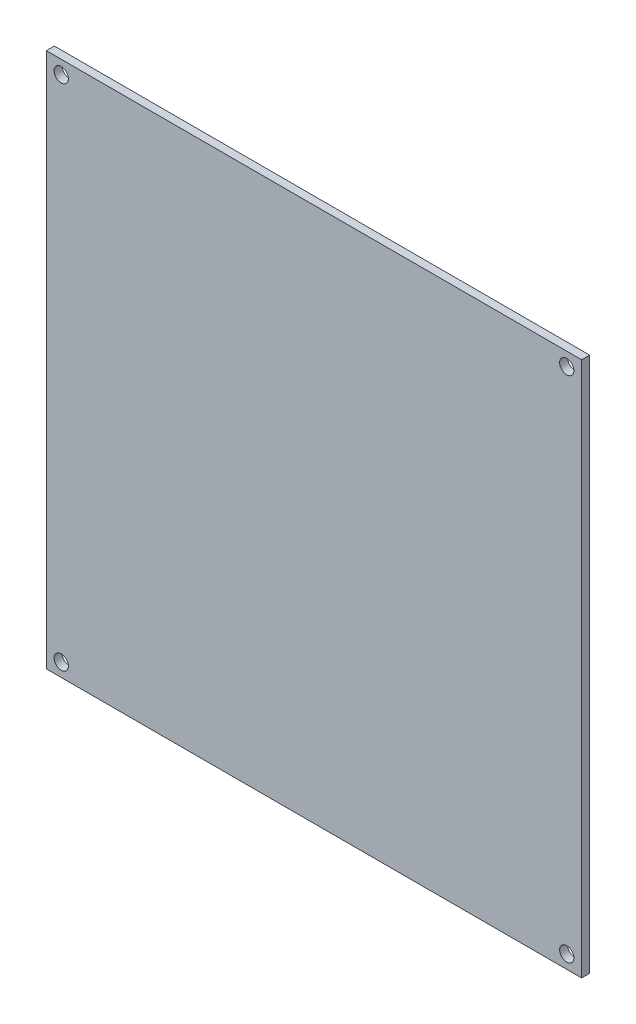
ISO-10303-21;
HEADER;
FILE_DESCRIPTION(('STEP AP214'),'2;1');
FILE_NAME('part.step','',(''),(''),'','','');
FILE_SCHEMA(('AUTOMOTIVE_DESIGN { 1 0 10303 214 1 1 1 1 }'));
ENDSEC;
DATA;
#1=APPLICATION_CONTEXT('core data for automotive mechanical design processes');
#2=APPLICATION_PROTOCOL_DEFINITION('international standard','automotive_design',2000,#1);
#3=PRODUCT_CONTEXT('',#1,'mechanical');
#4=PRODUCT('Part','Part','',(#3));
#5=PRODUCT_RELATED_PRODUCT_CATEGORY('part','',(#4));
#6=PRODUCT_DEFINITION_FORMATION('','',#4);
#7=PRODUCT_DEFINITION_CONTEXT('part definition',#1,'design');
#8=PRODUCT_DEFINITION('design','',#6,#7);
#9=PRODUCT_DEFINITION_SHAPE('','',#8);
#10=(LENGTH_UNIT() NAMED_UNIT(*) SI_UNIT(.MILLI.,.METRE.));
#11=(NAMED_UNIT(*) PLANE_ANGLE_UNIT() SI_UNIT($,.RADIAN.));
#12=(NAMED_UNIT(*) SI_UNIT($,.STERADIAN.) SOLID_ANGLE_UNIT());
#13=UNCERTAINTY_MEASURE_WITH_UNIT(LENGTH_MEASURE(1.E-05),#10,'distance_accuracy_value','');
#14=(GEOMETRIC_REPRESENTATION_CONTEXT(3) GLOBAL_UNCERTAINTY_ASSIGNED_CONTEXT((#13)) GLOBAL_UNIT_ASSIGNED_CONTEXT((#10,
#11,#12)) REPRESENTATION_CONTEXT('',''));
#15=CARTESIAN_POINT('',(0.,0.,0.));
#16=DIRECTION('',(0.,0.,1.));
#17=DIRECTION('',(1.,0.,0.));
#18=AXIS2_PLACEMENT_3D('',#15,#16,#17);
#19=CARTESIAN_POINT('',(0.,0.,1.8));
#20=DIRECTION('',(0.,0.,-1.));
#21=DIRECTION('',(-1.,0.,0.));
#22=AXIS2_PLACEMENT_3D('',#19,#20,#21);
#23=PLANE('',#22);
#24=DIRECTION('',(0.,-1.,0.));
#25=VECTOR('',#24,1.);
#26=CARTESIAN_POINT('',(0.,0.,1.8));
#27=LINE('',#26,#25);
#28=CARTESIAN_POINT('',(0.,120.,1.8));
#29=VERTEX_POINT('',#28);
#30=CARTESIAN_POINT('',(0.,0.,1.8));
#31=VERTEX_POINT('',#30);
#32=EDGE_CURVE('E85',#29,#31,#27,.T.);
#33=ORIENTED_EDGE('',*,*,#32,.T.);
#34=DIRECTION('',(1.,0.,0.));
#35=VECTOR('',#34,1.);
#36=CARTESIAN_POINT('',(0.,0.,1.8));
#37=LINE('',#36,#35);
#38=CARTESIAN_POINT('',(120.,0.,1.8));
#39=VERTEX_POINT('',#38);
#40=EDGE_CURVE('E80',#31,#39,#37,.T.);
#41=ORIENTED_EDGE('',*,*,#40,.T.);
#42=DIRECTION('',(0.,1.,0.));
#43=VECTOR('',#42,1.);
#44=CARTESIAN_POINT('',(120.,0.,1.8));
#45=LINE('',#44,#43);
#46=CARTESIAN_POINT('',(120.,120.,1.8));
#47=VERTEX_POINT('',#46);
#48=EDGE_CURVE('E83',#39,#47,#45,.T.);
#49=ORIENTED_EDGE('',*,*,#48,.T.);
#50=DIRECTION('',(-1.,0.,0.));
#51=VECTOR('',#50,1.);
#52=CARTESIAN_POINT('',(0.,120.,1.8));
#53=LINE('',#52,#51);
#54=EDGE_CURVE('E50',#47,#29,#53,.T.);
#55=ORIENTED_EDGE('',*,*,#54,.T.);
#56=EDGE_LOOP('',(#33,#41,#49,#55));
#57=FACE_BOUND('',#56,.T.);
#58=CARTESIAN_POINT('',(3.35,117.,1.8));
#59=DIRECTION('',(0.,0.,1.));
#60=DIRECTION('',(1.,0.,0.));
#61=AXIS2_PLACEMENT_3D('',#58,#59,#60);
#62=CIRCLE('',#61,1.60000000000001);
#63=CARTESIAN_POINT('',(4.95000000000001,117.,1.8));
#64=VERTEX_POINT('',#63);
#65=EDGE_CURVE('E100',#64,#64,#62,.T.);
#66=ORIENTED_EDGE('',*,*,#65,.F.);
#67=EDGE_LOOP('',(#66));
#68=FACE_BOUND('',#67,.T.);
#69=CARTESIAN_POINT('',(116.65,117.,1.8));
#70=DIRECTION('',(0.,0.,1.));
#71=DIRECTION('',(1.,0.,0.));
#72=AXIS2_PLACEMENT_3D('',#69,#70,#71);
#73=CIRCLE('',#72,1.60000000000001);
#74=CARTESIAN_POINT('',(118.25,117.,1.8));
#75=VERTEX_POINT('',#74);
#76=EDGE_CURVE('E115',#75,#75,#73,.T.);
#77=ORIENTED_EDGE('',*,*,#76,.F.);
#78=EDGE_LOOP('',(#77));
#79=FACE_BOUND('',#78,.T.);
#80=CARTESIAN_POINT('',(116.65,2.99999999999999,1.8));
#81=DIRECTION('',(0.,0.,1.));
#82=DIRECTION('',(1.,0.,0.));
#83=AXIS2_PLACEMENT_3D('',#80,#81,#82);
#84=CIRCLE('',#83,1.60000000000001);
#85=CARTESIAN_POINT('',(118.25,2.99999999999999,1.8));
#86=VERTEX_POINT('',#85);
#87=EDGE_CURVE('E121',#86,#86,#84,.T.);
#88=ORIENTED_EDGE('',*,*,#87,.F.);
#89=EDGE_LOOP('',(#88));
#90=FACE_BOUND('',#89,.T.);
#91=CARTESIAN_POINT('',(3.35,2.99999999999999,1.8));
#92=DIRECTION('',(0.,0.,1.));
#93=DIRECTION('',(1.,0.,0.));
#94=AXIS2_PLACEMENT_3D('',#91,#92,#93);
#95=CIRCLE('',#94,1.6);
#96=CARTESIAN_POINT('',(4.95,2.99999999999999,1.8));
#97=VERTEX_POINT('',#96);
#98=EDGE_CURVE('E127',#97,#97,#95,.T.);
#99=ORIENTED_EDGE('',*,*,#98,.F.);
#100=EDGE_LOOP('',(#99));
#101=FACE_BOUND('',#100,.T.);
#102=ADVANCED_FACE('F33',(#57,#68,#79,#90,#101),#23,.F.);
#103=CARTESIAN_POINT('',(0.,0.,0.));
#104=DIRECTION('',(0.,0.,-1.));
#105=DIRECTION('',(-1.,0.,0.));
#106=AXIS2_PLACEMENT_3D('',#103,#104,#105);
#107=PLANE('',#106);
#108=CARTESIAN_POINT('',(116.65,2.99999999999999,0.));
#109=DIRECTION('',(0.,0.,1.));
#110=DIRECTION('',(1.,0.,0.));
#111=AXIS2_PLACEMENT_3D('',#108,#109,#110);
#112=CIRCLE('',#111,1.60000000000001);
#113=CARTESIAN_POINT('',(118.25,2.99999999999999,0.));
#114=VERTEX_POINT('',#113);
#115=EDGE_CURVE('E124',#114,#114,#112,.T.);
#116=ORIENTED_EDGE('',*,*,#115,.T.);
#117=EDGE_LOOP('',(#116));
#118=FACE_BOUND('',#117,.T.);
#119=CARTESIAN_POINT('',(3.35,117.,0.));
#120=DIRECTION('',(0.,0.,1.));
#121=DIRECTION('',(1.,0.,0.));
#122=AXIS2_PLACEMENT_3D('',#119,#120,#121);
#123=CIRCLE('',#122,1.60000000000001);
#124=CARTESIAN_POINT('',(4.95000000000001,117.,0.));
#125=VERTEX_POINT('',#124);
#126=EDGE_CURVE('E112',#125,#125,#123,.T.);
#127=ORIENTED_EDGE('',*,*,#126,.T.);
#128=EDGE_LOOP('',(#127));
#129=FACE_BOUND('',#128,.T.);
#130=DIRECTION('',(0.,-1.,0.));
#131=VECTOR('',#130,1.);
#132=CARTESIAN_POINT('',(0.,0.,0.));
#133=LINE('',#132,#131);
#134=CARTESIAN_POINT('',(0.,120.,0.));
#135=VERTEX_POINT('',#134);
#136=CARTESIAN_POINT('',(0.,0.,0.));
#137=VERTEX_POINT('',#136);
#138=EDGE_CURVE('E97',#135,#137,#133,.T.);
#139=ORIENTED_EDGE('',*,*,#138,.F.);
#140=DIRECTION('',(-1.,0.,0.));
#141=VECTOR('',#140,1.);
#142=CARTESIAN_POINT('',(0.,120.,0.));
#143=LINE('',#142,#141);
#144=CARTESIAN_POINT('',(120.,120.,0.));
#145=VERTEX_POINT('',#144);
#146=EDGE_CURVE('E73',#145,#135,#143,.T.);
#147=ORIENTED_EDGE('',*,*,#146,.F.);
#148=DIRECTION('',(0.,1.,0.));
#149=VECTOR('',#148,1.);
#150=CARTESIAN_POINT('',(120.,0.,0.));
#151=LINE('',#150,#149);
#152=CARTESIAN_POINT('',(120.,0.,0.));
#153=VERTEX_POINT('',#152);
#154=EDGE_CURVE('E67',#153,#145,#151,.T.);
#155=ORIENTED_EDGE('',*,*,#154,.F.);
#156=DIRECTION('',(1.,0.,0.));
#157=VECTOR('',#156,1.);
#158=CARTESIAN_POINT('',(0.,0.,0.));
#159=LINE('',#158,#157);
#160=EDGE_CURVE('E89',#137,#153,#159,.T.);
#161=ORIENTED_EDGE('',*,*,#160,.F.);
#162=EDGE_LOOP('',(#139,#147,#155,#161));
#163=FACE_BOUND('',#162,.T.);
#164=CARTESIAN_POINT('',(116.65,117.,0.));
#165=DIRECTION('',(0.,0.,1.));
#166=DIRECTION('',(1.,0.,0.));
#167=AXIS2_PLACEMENT_3D('',#164,#165,#166);
#168=CIRCLE('',#167,1.60000000000001);
#169=CARTESIAN_POINT('',(118.25,117.,0.));
#170=VERTEX_POINT('',#169);
#171=EDGE_CURVE('E118',#170,#170,#168,.T.);
#172=ORIENTED_EDGE('',*,*,#171,.T.);
#173=EDGE_LOOP('',(#172));
#174=FACE_BOUND('',#173,.T.);
#175=CARTESIAN_POINT('',(3.35,2.99999999999999,0.));
#176=DIRECTION('',(0.,0.,1.));
#177=DIRECTION('',(1.,0.,0.));
#178=AXIS2_PLACEMENT_3D('',#175,#176,#177);
#179=CIRCLE('',#178,1.6);
#180=CARTESIAN_POINT('',(4.95,2.99999999999999,0.));
#181=VERTEX_POINT('',#180);
#182=EDGE_CURVE('E130',#181,#181,#179,.T.);
#183=ORIENTED_EDGE('',*,*,#182,.T.);
#184=EDGE_LOOP('',(#183));
#185=FACE_BOUND('',#184,.T.);
#186=ADVANCED_FACE('F108',(#118,#129,#163,#174,#185),#107,.T.);
#187=CARTESIAN_POINT('',(0.,0.,1.8));
#188=DIRECTION('',(1.,0.,0.));
#189=DIRECTION('',(0.,0.,-1.));
#190=AXIS2_PLACEMENT_3D('',#187,#188,#189);
#191=PLANE('',#190);
#192=ORIENTED_EDGE('',*,*,#138,.T.);
#193=DIRECTION('',(0.,0.,-1.));
#194=VECTOR('',#193,1.);
#195=CARTESIAN_POINT('',(0.,0.,1.8));
#196=LINE('',#195,#194);
#197=EDGE_CURVE('E11',#31,#137,#196,.T.);
#198=ORIENTED_EDGE('',*,*,#197,.F.);
#199=ORIENTED_EDGE('',*,*,#32,.F.);
#200=DIRECTION('',(0.,0.,-1.));
#201=VECTOR('',#200,1.);
#202=CARTESIAN_POINT('',(0.,120.,1.8));
#203=LINE('',#202,#201);
#204=EDGE_CURVE('E93',#29,#135,#203,.T.);
#205=ORIENTED_EDGE('',*,*,#204,.T.);
#206=EDGE_LOOP('',(#192,#198,#199,#205));
#207=FACE_BOUND('',#206,.T.);
#208=ADVANCED_FACE('F35',(#207),#191,.F.);
#209=CARTESIAN_POINT('',(0.,0.,1.8));
#210=DIRECTION('',(0.,1.,0.));
#211=DIRECTION('',(0.,0.,1.));
#212=AXIS2_PLACEMENT_3D('',#209,#210,#211);
#213=PLANE('',#212);
#214=ORIENTED_EDGE('',*,*,#160,.T.);
#215=DIRECTION('',(0.,0.,-1.));
#216=VECTOR('',#215,1.);
#217=CARTESIAN_POINT('',(120.,0.,1.8));
#218=LINE('',#217,#216);
#219=EDGE_CURVE('E42',#39,#153,#218,.T.);
#220=ORIENTED_EDGE('',*,*,#219,.F.);
#221=ORIENTED_EDGE('',*,*,#40,.F.);
#222=ORIENTED_EDGE('',*,*,#197,.T.);
#223=EDGE_LOOP('',(#214,#220,#221,#222));
#224=FACE_BOUND('',#223,.T.);
#225=ADVANCED_FACE('F88',(#224),#213,.F.);
#226=CARTESIAN_POINT('',(120.,0.,1.8));
#227=DIRECTION('',(-1.,0.,0.));
#228=DIRECTION('',(0.,0.,1.));
#229=AXIS2_PLACEMENT_3D('',#226,#227,#228);
#230=PLANE('',#229);
#231=ORIENTED_EDGE('',*,*,#154,.T.);
#232=DIRECTION('',(0.,0.,-1.));
#233=VECTOR('',#232,1.);
#234=CARTESIAN_POINT('',(120.,120.,1.8));
#235=LINE('',#234,#233);
#236=EDGE_CURVE('E90',#47,#145,#235,.T.);
#237=ORIENTED_EDGE('',*,*,#236,.F.);
#238=ORIENTED_EDGE('',*,*,#48,.F.);
#239=ORIENTED_EDGE('',*,*,#219,.T.);
#240=EDGE_LOOP('',(#231,#237,#238,#239));
#241=FACE_BOUND('',#240,.T.);
#242=ADVANCED_FACE('F91',(#241),#230,.F.);
#243=CARTESIAN_POINT('',(0.,120.,1.8));
#244=DIRECTION('',(0.,-1.,0.));
#245=DIRECTION('',(0.,0.,-1.));
#246=AXIS2_PLACEMENT_3D('',#243,#244,#245);
#247=PLANE('',#246);
#248=ORIENTED_EDGE('',*,*,#146,.T.);
#249=ORIENTED_EDGE('',*,*,#204,.F.);
#250=ORIENTED_EDGE('',*,*,#54,.F.);
#251=ORIENTED_EDGE('',*,*,#236,.T.);
#252=EDGE_LOOP('',(#248,#249,#250,#251));
#253=FACE_BOUND('',#252,.T.);
#254=ADVANCED_FACE('F105',(#253),#247,.F.);
#255=CARTESIAN_POINT('',(3.35,117.,1.8));
#256=DIRECTION('',(0.,0.,-1.));
#257=DIRECTION('',(-1.,0.,0.));
#258=AXIS2_PLACEMENT_3D('',#255,#256,#257);
#259=CYLINDRICAL_SURFACE('',#258,1.60000000000001);
#260=ORIENTED_EDGE('',*,*,#65,.T.);
#261=EDGE_LOOP('',(#260));
#262=FACE_BOUND('',#261,.T.);
#263=ORIENTED_EDGE('',*,*,#126,.F.);
#264=EDGE_LOOP('',(#263));
#265=FACE_BOUND('',#264,.T.);
#266=ADVANCED_FACE('F147',(#262,#265),#259,.F.);
#267=CARTESIAN_POINT('',(116.65,117.,1.8));
#268=DIRECTION('',(0.,0.,-1.));
#269=DIRECTION('',(-1.,0.,0.));
#270=AXIS2_PLACEMENT_3D('',#267,#268,#269);
#271=CYLINDRICAL_SURFACE('',#270,1.60000000000001);
#272=ORIENTED_EDGE('',*,*,#76,.T.);
#273=EDGE_LOOP('',(#272));
#274=FACE_BOUND('',#273,.T.);
#275=ORIENTED_EDGE('',*,*,#171,.F.);
#276=EDGE_LOOP('',(#275));
#277=FACE_BOUND('',#276,.T.);
#278=ADVANCED_FACE('F193',(#274,#277),#271,.F.);
#279=CARTESIAN_POINT('',(116.65,2.99999999999999,1.8));
#280=DIRECTION('',(0.,0.,-1.));
#281=DIRECTION('',(-1.,0.,0.));
#282=AXIS2_PLACEMENT_3D('',#279,#280,#281);
#283=CYLINDRICAL_SURFACE('',#282,1.60000000000001);
#284=ORIENTED_EDGE('',*,*,#87,.T.);
#285=EDGE_LOOP('',(#284));
#286=FACE_BOUND('',#285,.T.);
#287=ORIENTED_EDGE('',*,*,#115,.F.);
#288=EDGE_LOOP('',(#287));
#289=FACE_BOUND('',#288,.T.);
#290=ADVANCED_FACE('F201',(#286,#289),#283,.F.);
#291=CARTESIAN_POINT('',(3.35,2.99999999999999,1.8));
#292=DIRECTION('',(0.,0.,-1.));
#293=DIRECTION('',(-1.,0.,0.));
#294=AXIS2_PLACEMENT_3D('',#291,#292,#293);
#295=CYLINDRICAL_SURFACE('',#294,1.6);
#296=ORIENTED_EDGE('',*,*,#98,.T.);
#297=EDGE_LOOP('',(#296));
#298=FACE_BOUND('',#297,.T.);
#299=ORIENTED_EDGE('',*,*,#182,.F.);
#300=EDGE_LOOP('',(#299));
#301=FACE_BOUND('',#300,.T.);
#302=ADVANCED_FACE('F136',(#298,#301),#295,.F.);
#303=CLOSED_SHELL('',(#102,#186,#208,#225,#242,#254,#266,#278,#290,#302));
#304=MANIFOLD_SOLID_BREP('B2',#303);
#305=ADVANCED_BREP_SHAPE_REPRESENTATION('',(#18,#304),#14);
#306=SHAPE_DEFINITION_REPRESENTATION(#9,#305);
ENDSEC;
END-ISO-10303-21;
